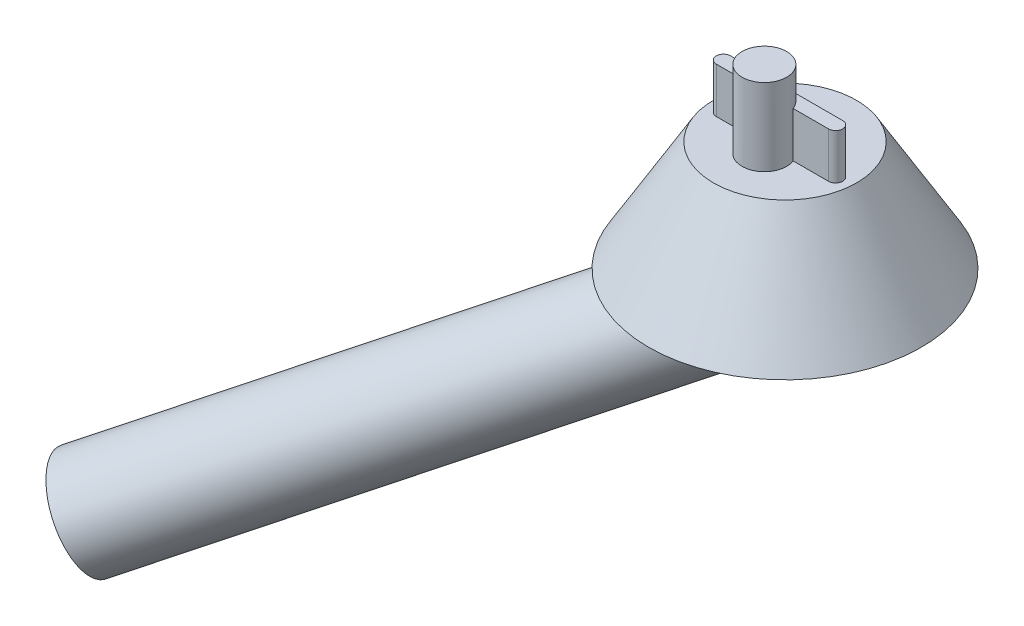
ISO-10303-21;
HEADER;
FILE_DESCRIPTION(('STEP AP214'),'2;1');
FILE_NAME('part.step','',(''),(''),'','','');
FILE_SCHEMA(('AUTOMOTIVE_DESIGN { 1 0 10303 214 1 1 1 1 }'));
ENDSEC;
DATA;
#1=APPLICATION_CONTEXT('core data for automotive mechanical design processes');
#2=APPLICATION_PROTOCOL_DEFINITION('international standard','automotive_design',2000,#1);
#3=PRODUCT_CONTEXT('',#1,'mechanical');
#4=PRODUCT('Part','Part','',(#3));
#5=PRODUCT_RELATED_PRODUCT_CATEGORY('part','',(#4));
#6=PRODUCT_DEFINITION_FORMATION('','',#4);
#7=PRODUCT_DEFINITION_CONTEXT('part definition',#1,'design');
#8=PRODUCT_DEFINITION('design','',#6,#7);
#9=PRODUCT_DEFINITION_SHAPE('','',#8);
#10=(LENGTH_UNIT() NAMED_UNIT(*) SI_UNIT(.MILLI.,.METRE.));
#11=(NAMED_UNIT(*) PLANE_ANGLE_UNIT() SI_UNIT($,.RADIAN.));
#12=(NAMED_UNIT(*) SI_UNIT($,.STERADIAN.) SOLID_ANGLE_UNIT());
#13=UNCERTAINTY_MEASURE_WITH_UNIT(LENGTH_MEASURE(1.E-05),#10,'distance_accuracy_value','');
#14=(GEOMETRIC_REPRESENTATION_CONTEXT(3) GLOBAL_UNCERTAINTY_ASSIGNED_CONTEXT((#13)) GLOBAL_UNIT_ASSIGNED_CONTEXT((#10,
#11,#12)) REPRESENTATION_CONTEXT('',''));
#15=CARTESIAN_POINT('',(0.,0.,0.));
#16=DIRECTION('',(0.,0.,1.));
#17=DIRECTION('',(1.,0.,0.));
#18=AXIS2_PLACEMENT_3D('',#15,#16,#17);
#19=CARTESIAN_POINT('',(0.,16.5,0.));
#20=DIRECTION('',(0.,-1.,0.));
#21=DIRECTION('',(0.,0.,-1.));
#22=AXIS2_PLACEMENT_3D('',#19,#20,#21);
#23=PLANE('',#22);
#24=CARTESIAN_POINT('',(0.,16.5,0.));
#25=DIRECTION('',(0.,1.,0.));
#26=DIRECTION('',(0.,0.,1.));
#27=AXIS2_PLACEMENT_3D('',#24,#25,#26);
#28=CIRCLE('',#27,10.75);
#29=CARTESIAN_POINT('',(0.,16.5,10.75));
#30=VERTEX_POINT('',#29);
#31=EDGE_CURVE('E121',#30,#30,#28,.T.);
#32=ORIENTED_EDGE('',*,*,#31,.T.);
#33=EDGE_LOOP('',(#32));
#34=FACE_BOUND('',#33,.T.);
#35=DIRECTION('',(1.,0.,0.));
#36=VECTOR('',#35,1.);
#37=CARTESIAN_POINT('',(-8.425,16.5,1.9));
#38=LINE('',#37,#36);
#39=CARTESIAN_POINT('',(-8.425,16.5,1.9));
#40=VERTEX_POINT('',#39);
#41=CARTESIAN_POINT('',(-3.12769883460668,16.5,1.9));
#42=VERTEX_POINT('',#41);
#43=EDGE_CURVE('E142',#40,#42,#38,.T.);
#44=ORIENTED_EDGE('',*,*,#43,.F.);
#45=CARTESIAN_POINT('',(-8.425,16.5,0.825000000000001));
#46=DIRECTION('',(0.,1.,0.));
#47=DIRECTION('',(0.,0.,1.));
#48=AXIS2_PLACEMENT_3D('',#45,#46,#47);
#49=CIRCLE('',#48,1.075);
#50=CARTESIAN_POINT('',(-8.425,16.5,-0.249999999999999));
#51=VERTEX_POINT('',#50);
#52=EDGE_CURVE('E105',#51,#40,#49,.T.);
#53=ORIENTED_EDGE('',*,*,#52,.F.);
#54=DIRECTION('',(-1.,0.,0.));
#55=VECTOR('',#54,1.);
#56=CARTESIAN_POINT('',(-8.425,16.5,-0.249999999999999));
#57=LINE('',#56,#55);
#58=CARTESIAN_POINT('',(8.425,16.5,-0.250000000000001));
#59=VERTEX_POINT('',#58);
#60=EDGE_CURVE('E101',#59,#51,#57,.T.);
#61=ORIENTED_EDGE('',*,*,#60,.F.);
#62=CARTESIAN_POINT('',(8.425,16.5,0.824999999999999));
#63=DIRECTION('',(0.,1.,0.));
#64=DIRECTION('',(0.,0.,1.));
#65=AXIS2_PLACEMENT_3D('',#62,#63,#64);
#66=CIRCLE('',#65,1.075);
#67=CARTESIAN_POINT('',(8.425,16.5,1.9));
#68=VERTEX_POINT('',#67);
#69=EDGE_CURVE('E141',#68,#59,#66,.T.);
#70=ORIENTED_EDGE('',*,*,#69,.F.);
#71=CARTESIAN_POINT('',(3.12769883460668,16.5,1.9));
#72=VERTEX_POINT('',#71);
#73=EDGE_CURVE('E134',#72,#68,#38,.T.);
#74=ORIENTED_EDGE('',*,*,#73,.F.);
#75=CARTESIAN_POINT('',(0.,16.5,3.1));
#76=DIRECTION('',(0.,1.,0.));
#77=DIRECTION('',(0.,0.,1.));
#78=AXIS2_PLACEMENT_3D('',#75,#76,#77);
#79=CIRCLE('',#78,3.35);
#80=EDGE_CURVE('E118',#42,#72,#79,.T.);
#81=ORIENTED_EDGE('',*,*,#80,.F.);
#82=EDGE_LOOP('',(#44,#53,#61,#70,#74,#81));
#83=FACE_BOUND('',#82,.T.);
#84=ADVANCED_FACE('F33',(#34,#83),#23,.F.);
#85=CARTESIAN_POINT('',(0.,28.1,3.1));
#86=DIRECTION('',(0.,-1.,0.));
#87=DIRECTION('',(0.,0.,-1.));
#88=AXIS2_PLACEMENT_3D('',#85,#86,#87);
#89=CYLINDRICAL_SURFACE('',#88,3.35);
#90=CARTESIAN_POINT('',(0.,28.1,3.1));
#91=DIRECTION('',(0.,1.,0.));
#92=DIRECTION('',(0.,0.,1.));
#93=AXIS2_PLACEMENT_3D('',#90,#91,#92);
#94=CIRCLE('',#93,3.35);
#95=CARTESIAN_POINT('',(0.,28.1,6.45));
#96=VERTEX_POINT('',#95);
#97=EDGE_CURVE('E107',#96,#96,#94,.T.);
#98=ORIENTED_EDGE('',*,*,#97,.F.);
#99=EDGE_LOOP('',(#98));
#100=FACE_BOUND('',#99,.T.);
#101=DIRECTION('',(0.,-1.,0.));
#102=VECTOR('',#101,1.);
#103=CARTESIAN_POINT('',(3.12769883460668,28.1,1.9));
#104=LINE('',#103,#102);
#105=CARTESIAN_POINT('',(3.12769883460668,23.32,1.9));
#106=VERTEX_POINT('',#105);
#107=EDGE_CURVE('E40',#106,#72,#104,.T.);
#108=ORIENTED_EDGE('',*,*,#107,.F.);
#109=CARTESIAN_POINT('',(0.,23.32,3.1));
#110=DIRECTION('',(0.,1.,0.));
#111=DIRECTION('',(0.,0.,1.));
#112=AXIS2_PLACEMENT_3D('',#109,#110,#111);
#113=CIRCLE('',#112,3.35);
#114=CARTESIAN_POINT('',(0.,23.32,-0.25));
#115=VERTEX_POINT('',#114);
#116=EDGE_CURVE('E127',#106,#115,#113,.T.);
#117=ORIENTED_EDGE('',*,*,#116,.T.);
#118=CARTESIAN_POINT('',(-3.12769883460668,23.32,1.9));
#119=VERTEX_POINT('',#118);
#120=EDGE_CURVE('E52',#115,#119,#113,.T.);
#121=ORIENTED_EDGE('',*,*,#120,.T.);
#122=DIRECTION('',(0.,-1.,0.));
#123=VECTOR('',#122,1.);
#124=CARTESIAN_POINT('',(-3.12769883460668,28.1,1.9));
#125=LINE('',#124,#123);
#126=EDGE_CURVE('E90',#42,#119,#125,.F.);
#127=ORIENTED_EDGE('',*,*,#126,.F.);
#128=ORIENTED_EDGE('',*,*,#80,.T.);
#129=EDGE_LOOP('',(#108,#117,#121,#127,#128));
#130=FACE_BOUND('',#129,.T.);
#131=ADVANCED_FACE('F144',(#100,#130),#89,.T.);
#132=CARTESIAN_POINT('',(0.,0.,0.));
#133=DIRECTION('',(0.,-1.,0.));
#134=DIRECTION('',(0.,0.,-1.));
#135=AXIS2_PLACEMENT_3D('',#132,#133,#134);
#136=CONICAL_SURFACE('',#135,20.5,0.533708191639262);
#137=ORIENTED_EDGE('',*,*,#31,.F.);
#138=EDGE_LOOP('',(#137));
#139=FACE_BOUND('',#138,.T.);
#140=CARTESIAN_POINT('',(0.,0.,0.));
#141=DIRECTION('',(0.,1.,0.));
#142=DIRECTION('',(0.,0.,1.));
#143=AXIS2_PLACEMENT_3D('',#140,#141,#142);
#144=CIRCLE('',#143,20.5);
#145=CARTESIAN_POINT('',(0.,0.,20.5));
#146=VERTEX_POINT('',#145);
#147=EDGE_CURVE('E111',#146,#146,#144,.T.);
#148=ORIENTED_EDGE('',*,*,#147,.T.);
#149=EDGE_LOOP('',(#148));
#150=FACE_BOUND('',#149,.T.);
#151=ADVANCED_FACE('F181',(#139,#150),#136,.T.);
#152=CARTESIAN_POINT('',(0.,0.,0.));
#153=DIRECTION('',(0.,1.,0.));
#154=DIRECTION('',(0.,0.,1.));
#155=AXIS2_PLACEMENT_3D('',#152,#153,#154);
#156=PLANE('',#155);
#157=CARTESIAN_POINT('',(1.73762923611775,0.,-1.07521809081845));
#158=DIRECTION('',(0.,1.,0.));
#159=DIRECTION('',(-0.850365255825258,0.,0.526192865483032));
#160=AXIS2_PLACEMENT_3D('',#157,#158,#159);
#161=ELLIPSE('',#160,15.3254371365344,7.5);
#162=CARTESIAN_POINT('',(-11.2945900351252,0.,6.98891759083467));
#163=VERTEX_POINT('',#162);
#164=EDGE_CURVE('E11',#163,#163,#161,.T.);
#165=ORIENTED_EDGE('',*,*,#164,.T.);
#166=EDGE_LOOP('',(#165));
#167=FACE_BOUND('',#166,.T.);
#168=ORIENTED_EDGE('',*,*,#147,.F.);
#169=EDGE_LOOP('',(#168));
#170=FACE_BOUND('',#169,.T.);
#171=ADVANCED_FACE('F188',(#167,#170),#156,.F.);
#172=CARTESIAN_POINT('',(0.,28.1,3.1));
#173=DIRECTION('',(0.,1.,0.));
#174=DIRECTION('',(0.,0.,1.));
#175=AXIS2_PLACEMENT_3D('',#172,#173,#174);
#176=PLANE('',#175);
#177=ORIENTED_EDGE('',*,*,#97,.T.);
#178=EDGE_LOOP('',(#177));
#179=FACE_BOUND('',#178,.T.);
#180=ADVANCED_FACE('F192',(#179),#176,.T.);
#181=CARTESIAN_POINT('',(-8.425,23.32,1.9));
#182=DIRECTION('',(0.,0.,-1.));
#183=DIRECTION('',(-1.,0.,0.));
#184=AXIS2_PLACEMENT_3D('',#181,#182,#183);
#185=PLANE('',#184);
#186=DIRECTION('',(1.,0.,0.));
#187=VECTOR('',#186,1.);
#188=CARTESIAN_POINT('',(-8.425,23.32,1.9));
#189=LINE('',#188,#187);
#190=CARTESIAN_POINT('',(8.425,23.32,1.9));
#191=VERTEX_POINT('',#190);
#192=EDGE_CURVE('E92',#106,#191,#189,.T.);
#193=ORIENTED_EDGE('',*,*,#192,.F.);
#194=ORIENTED_EDGE('',*,*,#107,.T.);
#195=ORIENTED_EDGE('',*,*,#73,.T.);
#196=DIRECTION('',(0.,-1.,0.));
#197=VECTOR('',#196,1.);
#198=CARTESIAN_POINT('',(8.425,23.32,1.9));
#199=LINE('',#198,#197);
#200=EDGE_CURVE('E108',#191,#68,#199,.T.);
#201=ORIENTED_EDGE('',*,*,#200,.F.);
#202=EDGE_LOOP('',(#193,#194,#195,#201));
#203=FACE_BOUND('',#202,.T.);
#204=ADVANCED_FACE('F132',(#203),#185,.F.);
#205=ORIENTED_EDGE('',*,*,#43,.T.);
#206=ORIENTED_EDGE('',*,*,#126,.T.);
#207=CARTESIAN_POINT('',(-8.425,23.32,1.9));
#208=VERTEX_POINT('',#207);
#209=EDGE_CURVE('E47',#208,#119,#189,.T.);
#210=ORIENTED_EDGE('',*,*,#209,.F.);
#211=DIRECTION('',(0.,-1.,0.));
#212=VECTOR('',#211,1.);
#213=CARTESIAN_POINT('',(-8.425,23.32,1.9));
#214=LINE('',#213,#212);
#215=EDGE_CURVE('E87',#208,#40,#214,.T.);
#216=ORIENTED_EDGE('',*,*,#215,.T.);
#217=EDGE_LOOP('',(#205,#206,#210,#216));
#218=FACE_BOUND('',#217,.T.);
#219=ADVANCED_FACE('F85',(#218),#185,.F.);
#220=CARTESIAN_POINT('',(-8.425,23.32,-0.249999999999999));
#221=DIRECTION('',(0.,0.,1.));
#222=DIRECTION('',(1.,0.,0.));
#223=AXIS2_PLACEMENT_3D('',#220,#221,#222);
#224=PLANE('',#223);
#225=DIRECTION('',(-1.,0.,0.));
#226=VECTOR('',#225,1.);
#227=CARTESIAN_POINT('',(-8.425,23.32,-0.249999999999999));
#228=LINE('',#227,#226);
#229=CARTESIAN_POINT('',(-8.425,23.32,-0.249999999999999));
#230=VERTEX_POINT('',#229);
#231=EDGE_CURVE('E97',#115,#230,#228,.T.);
#232=ORIENTED_EDGE('',*,*,#231,.F.);
#233=CARTESIAN_POINT('',(8.425,23.32,-0.250000000000001));
#234=VERTEX_POINT('',#233);
#235=EDGE_CURVE('E149',#234,#115,#228,.T.);
#236=ORIENTED_EDGE('',*,*,#235,.F.);
#237=DIRECTION('',(0.,-1.,0.));
#238=VECTOR('',#237,1.);
#239=CARTESIAN_POINT('',(8.425,23.32,-0.250000000000001));
#240=LINE('',#239,#238);
#241=EDGE_CURVE('E114',#234,#59,#240,.T.);
#242=ORIENTED_EDGE('',*,*,#241,.T.);
#243=ORIENTED_EDGE('',*,*,#60,.T.);
#244=DIRECTION('',(0.,-1.,0.));
#245=VECTOR('',#244,1.);
#246=CARTESIAN_POINT('',(-8.425,23.32,-0.249999999999999));
#247=LINE('',#246,#245);
#248=EDGE_CURVE('E154',#230,#51,#247,.T.);
#249=ORIENTED_EDGE('',*,*,#248,.F.);
#250=EDGE_LOOP('',(#232,#236,#242,#243,#249));
#251=FACE_BOUND('',#250,.T.);
#252=ADVANCED_FACE('F162',(#251),#224,.F.);
#253=CARTESIAN_POINT('',(-8.425,23.32,0.825000000000001));
#254=DIRECTION('',(0.,1.,0.));
#255=DIRECTION('',(0.,0.,1.));
#256=AXIS2_PLACEMENT_3D('',#253,#254,#255);
#257=PLANE('',#256);
#258=ORIENTED_EDGE('',*,*,#116,.F.);
#259=ORIENTED_EDGE('',*,*,#192,.T.);
#260=CARTESIAN_POINT('',(8.425,23.32,0.824999999999999));
#261=DIRECTION('',(0.,1.,0.));
#262=DIRECTION('',(0.,0.,1.));
#263=AXIS2_PLACEMENT_3D('',#260,#261,#262);
#264=CIRCLE('',#263,1.075);
#265=EDGE_CURVE('E91',#191,#234,#264,.T.);
#266=ORIENTED_EDGE('',*,*,#265,.T.);
#267=ORIENTED_EDGE('',*,*,#235,.T.);
#268=EDGE_LOOP('',(#258,#259,#266,#267));
#269=FACE_BOUND('',#268,.T.);
#270=ADVANCED_FACE('F147',(#269),#257,.T.);
#271=CARTESIAN_POINT('',(-8.425,23.32,0.825000000000001));
#272=DIRECTION('',(0.,-1.,0.));
#273=DIRECTION('',(0.,0.,-1.));
#274=AXIS2_PLACEMENT_3D('',#271,#272,#273);
#275=CYLINDRICAL_SURFACE('',#274,1.075);
#276=ORIENTED_EDGE('',*,*,#52,.T.);
#277=ORIENTED_EDGE('',*,*,#215,.F.);
#278=CARTESIAN_POINT('',(-8.425,23.32,0.825000000000001));
#279=DIRECTION('',(0.,1.,0.));
#280=DIRECTION('',(0.,0.,1.));
#281=AXIS2_PLACEMENT_3D('',#278,#279,#280);
#282=CIRCLE('',#281,1.075);
#283=EDGE_CURVE('E95',#230,#208,#282,.T.);
#284=ORIENTED_EDGE('',*,*,#283,.F.);
#285=ORIENTED_EDGE('',*,*,#248,.T.);
#286=EDGE_LOOP('',(#276,#277,#284,#285));
#287=FACE_BOUND('',#286,.T.);
#288=ADVANCED_FACE('F103',(#287),#275,.T.);
#289=CARTESIAN_POINT('',(8.425,23.32,0.824999999999999));
#290=DIRECTION('',(0.,-1.,0.));
#291=DIRECTION('',(0.,0.,-1.));
#292=AXIS2_PLACEMENT_3D('',#289,#290,#291);
#293=CYLINDRICAL_SURFACE('',#292,1.075);
#294=ORIENTED_EDGE('',*,*,#69,.T.);
#295=ORIENTED_EDGE('',*,*,#241,.F.);
#296=ORIENTED_EDGE('',*,*,#265,.F.);
#297=ORIENTED_EDGE('',*,*,#200,.T.);
#298=EDGE_LOOP('',(#294,#295,#296,#297));
#299=FACE_BOUND('',#298,.T.);
#300=ADVANCED_FACE('F164',(#299),#293,.T.);
#301=ORIENTED_EDGE('',*,*,#120,.F.);
#302=ORIENTED_EDGE('',*,*,#231,.T.);
#303=ORIENTED_EDGE('',*,*,#283,.T.);
#304=ORIENTED_EDGE('',*,*,#209,.T.);
#305=EDGE_LOOP('',(#301,#302,#303,#304));
#306=FACE_BOUND('',#305,.T.);
#307=ADVANCED_FACE('F96',(#306),#257,.T.);
#308=CARTESIAN_POINT('',(499995.869028235,329956.590642202,-309389.709011946));
#309=DIRECTION('',(-0.741577409949088,-0.489382451748844,0.458876629360761));
#310=DIRECTION('',(0.550796235396929,-0.834639746880396,0.));
#311=AXIS2_PLACEMENT_3D('',#308,#309,#310);
#312=CYLINDRICAL_SURFACE('',#311,7.5);
#313=CARTESIAN_POINT('',(-65.1144005423799,-44.117053457248,40.2917837610306));
#314=DIRECTION('',(-0.741577409949088,-0.489382451748844,0.458876629360761));
#315=DIRECTION('',(0.550796235396929,-0.834639746880396,0.));
#316=AXIS2_PLACEMENT_3D('',#313,#314,#315);
#317=CIRCLE('',#316,7.5);
#318=CARTESIAN_POINT('',(-60.9834287769029,-50.3768515588509,40.2917837610306));
#319=VERTEX_POINT('',#318);
#320=EDGE_CURVE('E159',#319,#319,#317,.T.);
#321=ORIENTED_EDGE('',*,*,#320,.F.);
#322=EDGE_LOOP('',(#321));
#323=FACE_BOUND('',#322,.T.);
#324=ORIENTED_EDGE('',*,*,#164,.F.);
#325=EDGE_LOOP('',(#324));
#326=FACE_BOUND('',#325,.T.);
#327=ADVANCED_FACE('F171',(#323,#326),#312,.T.);
#328=CARTESIAN_POINT('',(-65.1144005423799,-44.117053457248,40.2917837610306));
#329=DIRECTION('',(-0.741577409949088,-0.489382451748844,0.458876629360761));
#330=DIRECTION('',(0.550796235396929,-0.834639746880396,0.));
#331=AXIS2_PLACEMENT_3D('',#328,#329,#330);
#332=PLANE('',#331);
#333=ORIENTED_EDGE('',*,*,#320,.T.);
#334=EDGE_LOOP('',(#333));
#335=FACE_BOUND('',#334,.T.);
#336=ADVANCED_FACE('F215',(#335),#332,.T.);
#337=CLOSED_SHELL('',(#84,#131,#151,#171,#180,#204,#219,#252,#270,#288,#300,#307,#327,#336));
#338=MANIFOLD_SOLID_BREP('B2',#337);
#339=ADVANCED_BREP_SHAPE_REPRESENTATION('',(#18,#338),#14);
#340=SHAPE_DEFINITION_REPRESENTATION(#9,#339);
ENDSEC;
END-ISO-10303-21;
